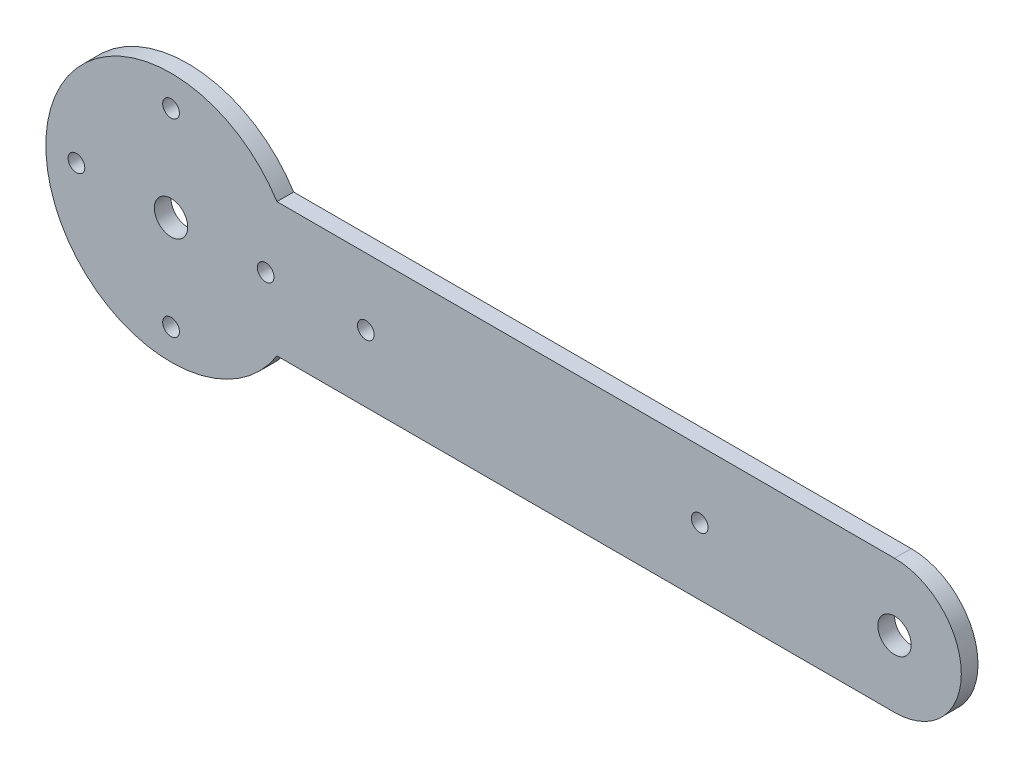
ISO-10303-21;
HEADER;
FILE_DESCRIPTION(('STEP AP214'),'2;1');
FILE_NAME('part.step','',(''),(''),'','','');
FILE_SCHEMA(('AUTOMOTIVE_DESIGN { 1 0 10303 214 1 1 1 1 }'));
ENDSEC;
DATA;
#1=APPLICATION_CONTEXT('core data for automotive mechanical design processes');
#2=APPLICATION_PROTOCOL_DEFINITION('international standard','automotive_design',2000,#1);
#3=PRODUCT_CONTEXT('',#1,'mechanical');
#4=PRODUCT('Part','Part','',(#3));
#5=PRODUCT_RELATED_PRODUCT_CATEGORY('part','',(#4));
#6=PRODUCT_DEFINITION_FORMATION('','',#4);
#7=PRODUCT_DEFINITION_CONTEXT('part definition',#1,'design');
#8=PRODUCT_DEFINITION('design','',#6,#7);
#9=PRODUCT_DEFINITION_SHAPE('','',#8);
#10=(LENGTH_UNIT() NAMED_UNIT(*) SI_UNIT(.MILLI.,.METRE.));
#11=(NAMED_UNIT(*) PLANE_ANGLE_UNIT() SI_UNIT($,.RADIAN.));
#12=(NAMED_UNIT(*) SI_UNIT($,.STERADIAN.) SOLID_ANGLE_UNIT());
#13=UNCERTAINTY_MEASURE_WITH_UNIT(LENGTH_MEASURE(1.E-05),#10,'distance_accuracy_value','');
#14=(GEOMETRIC_REPRESENTATION_CONTEXT(3) GLOBAL_UNCERTAINTY_ASSIGNED_CONTEXT((#13)) GLOBAL_UNIT_ASSIGNED_CONTEXT((#10,
#11,#12)) REPRESENTATION_CONTEXT('',''));
#15=CARTESIAN_POINT('',(0.,0.,0.));
#16=DIRECTION('',(0.,0.,1.));
#17=DIRECTION('',(1.,0.,0.));
#18=AXIS2_PLACEMENT_3D('',#15,#16,#17);
#19=CARTESIAN_POINT('',(-65.,-12.,3.));
#20=DIRECTION('',(0.,1.,0.));
#21=DIRECTION('',(-1.,0.,0.));
#22=AXIS2_PLACEMENT_3D('',#19,#20,#21);
#23=PLANE('',#22);
#24=DIRECTION('',(1.,0.,0.));
#25=VECTOR('',#24,1.);
#26=CARTESIAN_POINT('',(-65.,-12.,3.));
#27=LINE('',#26,#25);
#28=CARTESIAN_POINT('',(-45.9671336893257,-12.,3.));
#29=VERTEX_POINT('',#28);
#30=CARTESIAN_POINT('',(65.,-12.,3.));
#31=VERTEX_POINT('',#30);
#32=EDGE_CURVE('E103',#29,#31,#27,.T.);
#33=ORIENTED_EDGE('',*,*,#32,.F.);
#34=DIRECTION('',(0.,0.,1.));
#35=VECTOR('',#34,1.);
#36=CARTESIAN_POINT('',(-45.9671336893257,-12.,0.));
#37=LINE('',#36,#35);
#38=CARTESIAN_POINT('',(-45.9671336893257,-12.,0.));
#39=VERTEX_POINT('',#38);
#40=EDGE_CURVE('E87',#29,#39,#37,.F.);
#41=ORIENTED_EDGE('',*,*,#40,.T.);
#42=DIRECTION('',(1.,0.,0.));
#43=VECTOR('',#42,1.);
#44=CARTESIAN_POINT('',(-65.,-12.,0.));
#45=LINE('',#44,#43);
#46=CARTESIAN_POINT('',(65.,-12.,0.));
#47=VERTEX_POINT('',#46);
#48=EDGE_CURVE('E67',#39,#47,#45,.T.);
#49=ORIENTED_EDGE('',*,*,#48,.T.);
#50=DIRECTION('',(0.,0.,-1.));
#51=VECTOR('',#50,1.);
#52=CARTESIAN_POINT('',(65.,-12.,3.));
#53=LINE('',#52,#51);
#54=EDGE_CURVE('E11',#31,#47,#53,.T.);
#55=ORIENTED_EDGE('',*,*,#54,.F.);
#56=EDGE_LOOP('',(#33,#41,#49,#55));
#57=FACE_BOUND('',#56,.T.);
#58=ADVANCED_FACE('F40',(#57),#23,.F.);
#59=CARTESIAN_POINT('',(65.,0.,3.));
#60=DIRECTION('',(0.,0.,-1.));
#61=DIRECTION('',(-1.,0.,0.));
#62=AXIS2_PLACEMENT_3D('',#59,#60,#61);
#63=CYLINDRICAL_SURFACE('',#62,12.);
#64=CARTESIAN_POINT('',(65.,0.,0.));
#65=DIRECTION('',(0.,0.,1.));
#66=DIRECTION('',(-1.,0.,0.));
#67=AXIS2_PLACEMENT_3D('',#64,#65,#66);
#68=CIRCLE('',#67,12.);
#69=CARTESIAN_POINT('',(65.,12.,0.));
#70=VERTEX_POINT('',#69);
#71=EDGE_CURVE('E108',#47,#70,#68,.T.);
#72=ORIENTED_EDGE('',*,*,#71,.T.);
#73=DIRECTION('',(0.,0.,-1.));
#74=VECTOR('',#73,1.);
#75=CARTESIAN_POINT('',(65.,12.,3.));
#76=LINE('',#75,#74);
#77=CARTESIAN_POINT('',(65.,12.,3.));
#78=VERTEX_POINT('',#77);
#79=EDGE_CURVE('E48',#78,#70,#76,.T.);
#80=ORIENTED_EDGE('',*,*,#79,.F.);
#81=CARTESIAN_POINT('',(65.,0.,3.));
#82=DIRECTION('',(0.,0.,1.));
#83=DIRECTION('',(-1.,0.,0.));
#84=AXIS2_PLACEMENT_3D('',#81,#82,#83);
#85=CIRCLE('',#84,12.);
#86=EDGE_CURVE('E56',#31,#78,#85,.T.);
#87=ORIENTED_EDGE('',*,*,#86,.F.);
#88=ORIENTED_EDGE('',*,*,#54,.T.);
#89=EDGE_LOOP('',(#72,#80,#87,#88));
#90=FACE_BOUND('',#89,.T.);
#91=ADVANCED_FACE('F203',(#90),#63,.T.);
#92=CARTESIAN_POINT('',(-65.,12.,3.));
#93=DIRECTION('',(0.,-1.,0.));
#94=DIRECTION('',(1.,0.,0.));
#95=AXIS2_PLACEMENT_3D('',#92,#93,#94);
#96=PLANE('',#95);
#97=DIRECTION('',(-1.,0.,0.));
#98=VECTOR('',#97,1.);
#99=CARTESIAN_POINT('',(-65.,12.,0.));
#100=LINE('',#99,#98);
#101=CARTESIAN_POINT('',(-45.9671336893257,12.,0.));
#102=VERTEX_POINT('',#101);
#103=EDGE_CURVE('E98',#70,#102,#100,.T.);
#104=ORIENTED_EDGE('',*,*,#103,.T.);
#105=DIRECTION('',(0.,0.,1.));
#106=VECTOR('',#105,1.);
#107=CARTESIAN_POINT('',(-45.9671336893257,12.,0.));
#108=LINE('',#107,#106);
#109=CARTESIAN_POINT('',(-45.9671336893257,12.,3.));
#110=VERTEX_POINT('',#109);
#111=EDGE_CURVE('E86',#102,#110,#108,.T.);
#112=ORIENTED_EDGE('',*,*,#111,.T.);
#113=DIRECTION('',(-1.,0.,0.));
#114=VECTOR('',#113,1.);
#115=CARTESIAN_POINT('',(-65.,12.,3.));
#116=LINE('',#115,#114);
#117=EDGE_CURVE('E96',#78,#110,#116,.T.);
#118=ORIENTED_EDGE('',*,*,#117,.F.);
#119=ORIENTED_EDGE('',*,*,#79,.T.);
#120=EDGE_LOOP('',(#104,#112,#118,#119));
#121=FACE_BOUND('',#120,.T.);
#122=ADVANCED_FACE('F94',(#121),#96,.F.);
#123=CARTESIAN_POINT('',(-65.,0.,3.));
#124=DIRECTION('',(0.,0.,1.));
#125=DIRECTION('',(1.,0.,0.));
#126=AXIS2_PLACEMENT_3D('',#123,#124,#125);
#127=PLANE('',#126);
#128=CARTESIAN_POINT('',(-65.,17.,3.));
#129=DIRECTION('',(0.,0.,-1.));
#130=DIRECTION('',(-1.,0.,0.));
#131=AXIS2_PLACEMENT_3D('',#128,#129,#130);
#132=CIRCLE('',#131,1.5);
#133=CARTESIAN_POINT('',(-66.5,17.,3.));
#134=VERTEX_POINT('',#133);
#135=EDGE_CURVE('E89',#134,#134,#132,.T.);
#136=ORIENTED_EDGE('',*,*,#135,.T.);
#137=EDGE_LOOP('',(#136));
#138=FACE_BOUND('',#137,.T.);
#139=CARTESIAN_POINT('',(-82.0000000000002,1.80411241501588E-13,3.));
#140=DIRECTION('',(0.,0.,-1.));
#141=DIRECTION('',(-1.,0.,0.));
#142=AXIS2_PLACEMENT_3D('',#139,#140,#141);
#143=CIRCLE('',#142,1.5);
#144=CARTESIAN_POINT('',(-83.5000000000002,1.80411241501588E-13,3.));
#145=VERTEX_POINT('',#144);
#146=EDGE_CURVE('E152',#145,#145,#143,.T.);
#147=ORIENTED_EDGE('',*,*,#146,.T.);
#148=EDGE_LOOP('',(#147));
#149=FACE_BOUND('',#148,.T.);
#150=CARTESIAN_POINT('',(-65.0000000000003,-17.,3.));
#151=DIRECTION('',(0.,0.,-1.));
#152=DIRECTION('',(-1.,0.,0.));
#153=AXIS2_PLACEMENT_3D('',#150,#151,#152);
#154=CIRCLE('',#153,1.49999999999999);
#155=CARTESIAN_POINT('',(-66.5000000000003,-17.,3.));
#156=VERTEX_POINT('',#155);
#157=EDGE_CURVE('E146',#156,#156,#154,.T.);
#158=ORIENTED_EDGE('',*,*,#157,.T.);
#159=EDGE_LOOP('',(#158));
#160=FACE_BOUND('',#159,.T.);
#161=CARTESIAN_POINT('',(-48.0000000000002,0.,3.));
#162=DIRECTION('',(0.,0.,-1.));
#163=DIRECTION('',(-1.,0.,0.));
#164=AXIS2_PLACEMENT_3D('',#161,#162,#163);
#165=CIRCLE('',#164,1.49999999999999);
#166=CARTESIAN_POINT('',(-49.5000000000002,0.,3.));
#167=VERTEX_POINT('',#166);
#168=EDGE_CURVE('E140',#167,#167,#165,.T.);
#169=ORIENTED_EDGE('',*,*,#168,.T.);
#170=EDGE_LOOP('',(#169));
#171=FACE_BOUND('',#170,.T.);
#172=CARTESIAN_POINT('',(-65.,0.,3.));
#173=DIRECTION('',(0.,0.,1.));
#174=DIRECTION('',(1.,0.,0.));
#175=AXIS2_PLACEMENT_3D('',#172,#173,#174);
#176=CIRCLE('',#175,22.5);
#177=EDGE_CURVE('E83',#110,#29,#176,.T.);
#178=ORIENTED_EDGE('',*,*,#177,.T.);
#179=ORIENTED_EDGE('',*,*,#32,.T.);
#180=ORIENTED_EDGE('',*,*,#86,.T.);
#181=ORIENTED_EDGE('',*,*,#117,.T.);
#182=EDGE_LOOP('',(#178,#179,#180,#181));
#183=FACE_BOUND('',#182,.T.);
#184=CARTESIAN_POINT('',(30.,0.,3.));
#185=DIRECTION('',(0.,0.,1.));
#186=DIRECTION('',(-1.,0.,0.));
#187=AXIS2_PLACEMENT_3D('',#184,#185,#186);
#188=CIRCLE('',#187,1.5);
#189=CARTESIAN_POINT('',(28.5,0.,3.));
#190=VERTEX_POINT('',#189);
#191=EDGE_CURVE('E126',#190,#190,#188,.T.);
#192=ORIENTED_EDGE('',*,*,#191,.F.);
#193=EDGE_LOOP('',(#192));
#194=FACE_BOUND('',#193,.T.);
#195=CARTESIAN_POINT('',(-30.,0.,3.));
#196=DIRECTION('',(0.,0.,1.));
#197=DIRECTION('',(1.,0.,0.));
#198=AXIS2_PLACEMENT_3D('',#195,#196,#197);
#199=CIRCLE('',#198,1.5);
#200=CARTESIAN_POINT('',(-28.5,0.,3.));
#201=VERTEX_POINT('',#200);
#202=EDGE_CURVE('E112',#201,#201,#199,.T.);
#203=ORIENTED_EDGE('',*,*,#202,.F.);
#204=EDGE_LOOP('',(#203));
#205=FACE_BOUND('',#204,.T.);
#206=CARTESIAN_POINT('',(65.,0.,3.));
#207=DIRECTION('',(0.,0.,1.));
#208=DIRECTION('',(-1.,0.,0.));
#209=AXIS2_PLACEMENT_3D('',#206,#207,#208);
#210=CIRCLE('',#209,3.00000000000001);
#211=CARTESIAN_POINT('',(62.,0.,3.));
#212=VERTEX_POINT('',#211);
#213=EDGE_CURVE('E119',#212,#212,#210,.T.);
#214=ORIENTED_EDGE('',*,*,#213,.F.);
#215=EDGE_LOOP('',(#214));
#216=FACE_BOUND('',#215,.T.);
#217=CARTESIAN_POINT('',(-65.,0.,3.));
#218=DIRECTION('',(0.,0.,1.));
#219=DIRECTION('',(1.,0.,0.));
#220=AXIS2_PLACEMENT_3D('',#217,#218,#219);
#221=CIRCLE('',#220,3.00000000000001);
#222=CARTESIAN_POINT('',(-62.,0.,3.));
#223=VERTEX_POINT('',#222);
#224=EDGE_CURVE('E125',#223,#223,#221,.T.);
#225=ORIENTED_EDGE('',*,*,#224,.F.);
#226=EDGE_LOOP('',(#225));
#227=FACE_BOUND('',#226,.T.);
#228=ADVANCED_FACE('F100',(#138,#149,#160,#171,#183,#194,#205,#216,#227),#127,.T.);
#229=CARTESIAN_POINT('',(-65.,0.,0.));
#230=DIRECTION('',(0.,0.,1.));
#231=DIRECTION('',(1.,0.,0.));
#232=AXIS2_PLACEMENT_3D('',#229,#230,#231);
#233=PLANE('',#232);
#234=CARTESIAN_POINT('',(-65.,17.,0.));
#235=DIRECTION('',(0.,0.,-1.));
#236=DIRECTION('',(-1.,0.,0.));
#237=AXIS2_PLACEMENT_3D('',#234,#235,#236);
#238=CIRCLE('',#237,1.5);
#239=CARTESIAN_POINT('',(-66.5,17.,0.));
#240=VERTEX_POINT('',#239);
#241=EDGE_CURVE('E155',#240,#240,#238,.T.);
#242=ORIENTED_EDGE('',*,*,#241,.F.);
#243=EDGE_LOOP('',(#242));
#244=FACE_BOUND('',#243,.T.);
#245=CARTESIAN_POINT('',(-82.0000000000002,1.80411241501588E-13,0.));
#246=DIRECTION('',(0.,0.,-1.));
#247=DIRECTION('',(-1.,0.,0.));
#248=AXIS2_PLACEMENT_3D('',#245,#246,#247);
#249=CIRCLE('',#248,1.5);
#250=CARTESIAN_POINT('',(-83.5000000000002,1.80411241501588E-13,0.));
#251=VERTEX_POINT('',#250);
#252=EDGE_CURVE('E149',#251,#251,#249,.T.);
#253=ORIENTED_EDGE('',*,*,#252,.F.);
#254=EDGE_LOOP('',(#253));
#255=FACE_BOUND('',#254,.T.);
#256=CARTESIAN_POINT('',(-65.0000000000003,-17.,0.));
#257=DIRECTION('',(0.,0.,-1.));
#258=DIRECTION('',(-1.,0.,0.));
#259=AXIS2_PLACEMENT_3D('',#256,#257,#258);
#260=CIRCLE('',#259,1.49999999999999);
#261=CARTESIAN_POINT('',(-66.5000000000003,-17.,0.));
#262=VERTEX_POINT('',#261);
#263=EDGE_CURVE('E143',#262,#262,#260,.T.);
#264=ORIENTED_EDGE('',*,*,#263,.F.);
#265=EDGE_LOOP('',(#264));
#266=FACE_BOUND('',#265,.T.);
#267=CARTESIAN_POINT('',(-48.0000000000002,0.,0.));
#268=DIRECTION('',(0.,0.,-1.));
#269=DIRECTION('',(-1.,0.,0.));
#270=AXIS2_PLACEMENT_3D('',#267,#268,#269);
#271=CIRCLE('',#270,1.49999999999999);
#272=CARTESIAN_POINT('',(-49.5000000000002,0.,0.));
#273=VERTEX_POINT('',#272);
#274=EDGE_CURVE('E137',#273,#273,#271,.T.);
#275=ORIENTED_EDGE('',*,*,#274,.F.);
#276=EDGE_LOOP('',(#275));
#277=FACE_BOUND('',#276,.T.);
#278=ORIENTED_EDGE('',*,*,#48,.F.);
#279=CARTESIAN_POINT('',(-65.,0.,0.));
#280=DIRECTION('',(0.,0.,1.));
#281=DIRECTION('',(1.,0.,0.));
#282=AXIS2_PLACEMENT_3D('',#279,#280,#281);
#283=CIRCLE('',#282,22.5);
#284=EDGE_CURVE('E75',#102,#39,#283,.T.);
#285=ORIENTED_EDGE('',*,*,#284,.F.);
#286=ORIENTED_EDGE('',*,*,#103,.F.);
#287=ORIENTED_EDGE('',*,*,#71,.F.);
#288=EDGE_LOOP('',(#278,#285,#286,#287));
#289=FACE_BOUND('',#288,.T.);
#290=CARTESIAN_POINT('',(30.,0.,0.));
#291=DIRECTION('',(0.,0.,1.));
#292=DIRECTION('',(-1.,0.,0.));
#293=AXIS2_PLACEMENT_3D('',#290,#291,#292);
#294=CIRCLE('',#293,1.5);
#295=CARTESIAN_POINT('',(28.5,0.,0.));
#296=VERTEX_POINT('',#295);
#297=EDGE_CURVE('E116',#296,#296,#294,.T.);
#298=ORIENTED_EDGE('',*,*,#297,.T.);
#299=EDGE_LOOP('',(#298));
#300=FACE_BOUND('',#299,.T.);
#301=CARTESIAN_POINT('',(-30.,0.,0.));
#302=DIRECTION('',(0.,0.,1.));
#303=DIRECTION('',(1.,0.,0.));
#304=AXIS2_PLACEMENT_3D('',#301,#302,#303);
#305=CIRCLE('',#304,1.5);
#306=CARTESIAN_POINT('',(-28.5,0.,0.));
#307=VERTEX_POINT('',#306);
#308=EDGE_CURVE('E115',#307,#307,#305,.T.);
#309=ORIENTED_EDGE('',*,*,#308,.T.);
#310=EDGE_LOOP('',(#309));
#311=FACE_BOUND('',#310,.T.);
#312=CARTESIAN_POINT('',(65.,0.,0.));
#313=DIRECTION('',(0.,0.,1.));
#314=DIRECTION('',(-1.,0.,0.));
#315=AXIS2_PLACEMENT_3D('',#312,#313,#314);
#316=CIRCLE('',#315,3.00000000000001);
#317=CARTESIAN_POINT('',(62.,0.,0.));
#318=VERTEX_POINT('',#317);
#319=EDGE_CURVE('E122',#318,#318,#316,.T.);
#320=ORIENTED_EDGE('',*,*,#319,.T.);
#321=EDGE_LOOP('',(#320));
#322=FACE_BOUND('',#321,.T.);
#323=CARTESIAN_POINT('',(-65.,0.,0.));
#324=DIRECTION('',(0.,0.,1.));
#325=DIRECTION('',(1.,0.,0.));
#326=AXIS2_PLACEMENT_3D('',#323,#324,#325);
#327=CIRCLE('',#326,3.00000000000001);
#328=CARTESIAN_POINT('',(-62.,0.,0.));
#329=VERTEX_POINT('',#328);
#330=EDGE_CURVE('E109',#329,#329,#327,.T.);
#331=ORIENTED_EDGE('',*,*,#330,.T.);
#332=EDGE_LOOP('',(#331));
#333=FACE_BOUND('',#332,.T.);
#334=ADVANCED_FACE('F170',(#244,#255,#266,#277,#289,#300,#311,#322,#333),#233,.F.);
#335=CARTESIAN_POINT('',(65.,0.,0.));
#336=DIRECTION('',(0.,0.,1.));
#337=DIRECTION('',(1.,0.,0.));
#338=AXIS2_PLACEMENT_3D('',#335,#336,#337);
#339=CYLINDRICAL_SURFACE('',#338,3.00000000000001);
#340=ORIENTED_EDGE('',*,*,#319,.F.);
#341=EDGE_LOOP('',(#340));
#342=FACE_BOUND('',#341,.T.);
#343=ORIENTED_EDGE('',*,*,#213,.T.);
#344=EDGE_LOOP('',(#343));
#345=FACE_BOUND('',#344,.T.);
#346=ADVANCED_FACE('F173',(#342,#345),#339,.F.);
#347=CARTESIAN_POINT('',(-30.,0.,0.));
#348=DIRECTION('',(0.,0.,1.));
#349=DIRECTION('',(1.,0.,0.));
#350=AXIS2_PLACEMENT_3D('',#347,#348,#349);
#351=CYLINDRICAL_SURFACE('',#350,1.5);
#352=ORIENTED_EDGE('',*,*,#308,.F.);
#353=EDGE_LOOP('',(#352));
#354=FACE_BOUND('',#353,.T.);
#355=ORIENTED_EDGE('',*,*,#202,.T.);
#356=EDGE_LOOP('',(#355));
#357=FACE_BOUND('',#356,.T.);
#358=ADVANCED_FACE('F287',(#354,#357),#351,.F.);
#359=CARTESIAN_POINT('',(30.,0.,0.));
#360=DIRECTION('',(0.,0.,1.));
#361=DIRECTION('',(1.,0.,0.));
#362=AXIS2_PLACEMENT_3D('',#359,#360,#361);
#363=CYLINDRICAL_SURFACE('',#362,1.5);
#364=ORIENTED_EDGE('',*,*,#297,.F.);
#365=EDGE_LOOP('',(#364));
#366=FACE_BOUND('',#365,.T.);
#367=ORIENTED_EDGE('',*,*,#191,.T.);
#368=EDGE_LOOP('',(#367));
#369=FACE_BOUND('',#368,.T.);
#370=ADVANCED_FACE('F194',(#366,#369),#363,.F.);
#371=CARTESIAN_POINT('',(-65.,0.,0.));
#372=DIRECTION('',(0.,0.,1.));
#373=DIRECTION('',(1.,0.,0.));
#374=AXIS2_PLACEMENT_3D('',#371,#372,#373);
#375=CYLINDRICAL_SURFACE('',#374,3.00000000000001);
#376=ORIENTED_EDGE('',*,*,#330,.F.);
#377=EDGE_LOOP('',(#376));
#378=FACE_BOUND('',#377,.T.);
#379=ORIENTED_EDGE('',*,*,#224,.T.);
#380=EDGE_LOOP('',(#379));
#381=FACE_BOUND('',#380,.T.);
#382=ADVANCED_FACE('F191',(#378,#381),#375,.F.);
#383=CARTESIAN_POINT('',(-65.,0.,0.));
#384=DIRECTION('',(0.,0.,1.));
#385=DIRECTION('',(1.,0.,0.));
#386=AXIS2_PLACEMENT_3D('',#383,#384,#385);
#387=CYLINDRICAL_SURFACE('',#386,22.5);
#388=ORIENTED_EDGE('',*,*,#40,.F.);
#389=ORIENTED_EDGE('',*,*,#177,.F.);
#390=ORIENTED_EDGE('',*,*,#111,.F.);
#391=ORIENTED_EDGE('',*,*,#284,.T.);
#392=EDGE_LOOP('',(#388,#389,#390,#391));
#393=FACE_BOUND('',#392,.T.);
#394=ADVANCED_FACE('F85',(#393),#387,.T.);
#395=CARTESIAN_POINT('',(-48.0000000000002,0.,3.));
#396=DIRECTION('',(0.,0.,-1.));
#397=DIRECTION('',(-1.,0.,0.));
#398=AXIS2_PLACEMENT_3D('',#395,#396,#397);
#399=CYLINDRICAL_SURFACE('',#398,1.49999999999999);
#400=ORIENTED_EDGE('',*,*,#168,.F.);
#401=EDGE_LOOP('',(#400));
#402=FACE_BOUND('',#401,.T.);
#403=ORIENTED_EDGE('',*,*,#274,.T.);
#404=EDGE_LOOP('',(#403));
#405=FACE_BOUND('',#404,.T.);
#406=ADVANCED_FACE('F230',(#402,#405),#399,.F.);
#407=CARTESIAN_POINT('',(-65.0000000000003,-17.,3.));
#408=DIRECTION('',(0.,0.,-1.));
#409=DIRECTION('',(-1.,0.,0.));
#410=AXIS2_PLACEMENT_3D('',#407,#408,#409);
#411=CYLINDRICAL_SURFACE('',#410,1.49999999999999);
#412=ORIENTED_EDGE('',*,*,#157,.F.);
#413=EDGE_LOOP('',(#412));
#414=FACE_BOUND('',#413,.T.);
#415=ORIENTED_EDGE('',*,*,#263,.T.);
#416=EDGE_LOOP('',(#415));
#417=FACE_BOUND('',#416,.T.);
#418=ADVANCED_FACE('F253',(#414,#417),#411,.F.);
#419=CARTESIAN_POINT('',(-82.0000000000002,1.80411241501588E-13,3.));
#420=DIRECTION('',(0.,0.,-1.));
#421=DIRECTION('',(-1.,0.,0.));
#422=AXIS2_PLACEMENT_3D('',#419,#420,#421);
#423=CYLINDRICAL_SURFACE('',#422,1.5);
#424=ORIENTED_EDGE('',*,*,#146,.F.);
#425=EDGE_LOOP('',(#424));
#426=FACE_BOUND('',#425,.T.);
#427=ORIENTED_EDGE('',*,*,#252,.T.);
#428=EDGE_LOOP('',(#427));
#429=FACE_BOUND('',#428,.T.);
#430=ADVANCED_FACE('F166',(#426,#429),#423,.F.);
#431=CARTESIAN_POINT('',(-65.,17.,3.));
#432=DIRECTION('',(0.,0.,-1.));
#433=DIRECTION('',(-1.,0.,0.));
#434=AXIS2_PLACEMENT_3D('',#431,#432,#433);
#435=CYLINDRICAL_SURFACE('',#434,1.5);
#436=ORIENTED_EDGE('',*,*,#135,.F.);
#437=EDGE_LOOP('',(#436));
#438=FACE_BOUND('',#437,.T.);
#439=ORIENTED_EDGE('',*,*,#241,.T.);
#440=EDGE_LOOP('',(#439));
#441=FACE_BOUND('',#440,.T.);
#442=ADVANCED_FACE('F163',(#438,#441),#435,.F.);
#443=CLOSED_SHELL('',(#58,#91,#122,#228,#334,#346,#358,#370,#382,#394,#406,#418,#430,#442));
#444=MANIFOLD_SOLID_BREP('B2',#443);
#445=ADVANCED_BREP_SHAPE_REPRESENTATION('',(#18,#444),#14);
#446=SHAPE_DEFINITION_REPRESENTATION(#9,#445);
ENDSEC;
END-ISO-10303-21;
